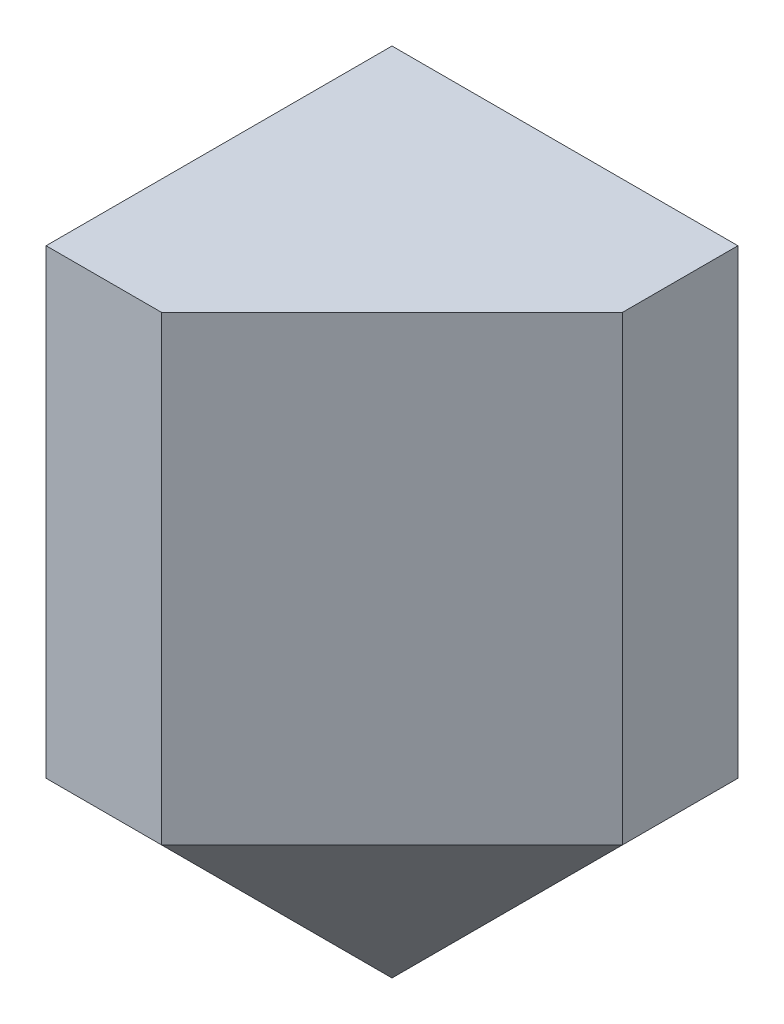
ISO-10303-21;
HEADER;
FILE_DESCRIPTION(('STEP AP214'),'2;1');
FILE_NAME('part.step','',(''),(''),'','','');
FILE_SCHEMA(('AUTOMOTIVE_DESIGN { 1 0 10303 214 1 1 1 1 }'));
ENDSEC;
DATA;
#1=APPLICATION_CONTEXT('core data for automotive mechanical design processes');
#2=APPLICATION_PROTOCOL_DEFINITION('international standard','automotive_design',2000,#1);
#3=PRODUCT_CONTEXT('',#1,'mechanical');
#4=PRODUCT('Part','Part','',(#3));
#5=PRODUCT_RELATED_PRODUCT_CATEGORY('part','',(#4));
#6=PRODUCT_DEFINITION_FORMATION('','',#4);
#7=PRODUCT_DEFINITION_CONTEXT('part definition',#1,'design');
#8=PRODUCT_DEFINITION('design','',#6,#7);
#9=PRODUCT_DEFINITION_SHAPE('','',#8);
#10=(LENGTH_UNIT() NAMED_UNIT(*) SI_UNIT(.MILLI.,.METRE.));
#11=(NAMED_UNIT(*) PLANE_ANGLE_UNIT() SI_UNIT($,.RADIAN.));
#12=(NAMED_UNIT(*) SI_UNIT($,.STERADIAN.) SOLID_ANGLE_UNIT());
#13=UNCERTAINTY_MEASURE_WITH_UNIT(LENGTH_MEASURE(1.E-05),#10,'distance_accuracy_value','');
#14=(GEOMETRIC_REPRESENTATION_CONTEXT(3) GLOBAL_UNCERTAINTY_ASSIGNED_CONTEXT((#13)) GLOBAL_UNIT_ASSIGNED_CONTEXT((#10,
#11,#12)) REPRESENTATION_CONTEXT('',''));
#15=CARTESIAN_POINT('',(0.,0.,0.));
#16=DIRECTION('',(0.,0.,1.));
#17=DIRECTION('',(1.,0.,0.));
#18=AXIS2_PLACEMENT_3D('',#15,#16,#17);
#19=CARTESIAN_POINT('',(0.,0.,30.));
#20=DIRECTION('',(1.,0.,0.));
#21=DIRECTION('',(0.,0.,-1.));
#22=AXIS2_PLACEMENT_3D('',#19,#20,#21);
#23=PLANE('',#22);
#24=CARTESIAN_POINT('',(0.,20.,18.));
#25=DIRECTION('',(-1.,0.,0.));
#26=DIRECTION('',(0.,0.,1.));
#27=AXIS2_PLACEMENT_3D('',#24,#25,#26);
#28=CIRCLE('',#27,2.74999999999999);
#29=CARTESIAN_POINT('',(0.,20.,20.75));
#30=VERTEX_POINT('',#29);
#31=EDGE_CURVE('E128',#30,#30,#28,.T.);
#32=ORIENTED_EDGE('',*,*,#31,.F.);
#33=EDGE_LOOP('',(#32));
#34=FACE_BOUND('',#33,.T.);
#35=CARTESIAN_POINT('',(0.,48.,14.));
#36=DIRECTION('',(-1.,0.,0.));
#37=DIRECTION('',(0.,0.,1.));
#38=AXIS2_PLACEMENT_3D('',#35,#36,#37);
#39=CIRCLE('',#38,2.75);
#40=CARTESIAN_POINT('',(0.,48.,16.75));
#41=VERTEX_POINT('',#40);
#42=EDGE_CURVE('E134',#41,#41,#39,.T.);
#43=ORIENTED_EDGE('',*,*,#42,.F.);
#44=EDGE_LOOP('',(#43));
#45=FACE_BOUND('',#44,.T.);
#46=DIRECTION('',(0.,0.,-1.));
#47=VECTOR('',#46,1.);
#48=CARTESIAN_POINT('',(0.,0.,30.));
#49=LINE('',#48,#47);
#50=CARTESIAN_POINT('',(0.,0.,9.99999999999995));
#51=VERTEX_POINT('',#50);
#52=CARTESIAN_POINT('',(0.,0.,0.));
#53=VERTEX_POINT('',#52);
#54=EDGE_CURVE('E159',#51,#53,#49,.T.);
#55=ORIENTED_EDGE('',*,*,#54,.F.);
#56=DIRECTION('',(0.,-0.707106781186546,-0.707106781186549));
#57=VECTOR('',#56,1.);
#58=CARTESIAN_POINT('',(0.,20.,30.));
#59=LINE('',#58,#57);
#60=CARTESIAN_POINT('',(0.,20.,30.));
#61=VERTEX_POINT('',#60);
#62=EDGE_CURVE('E11',#51,#61,#59,.F.);
#63=ORIENTED_EDGE('',*,*,#62,.T.);
#64=DIRECTION('',(0.,-1.,0.));
#65=VECTOR('',#64,1.);
#66=CARTESIAN_POINT('',(0.,0.,30.));
#67=LINE('',#66,#65);
#68=CARTESIAN_POINT('',(0.,60.,30.));
#69=VERTEX_POINT('',#68);
#70=EDGE_CURVE('E156',#69,#61,#67,.T.);
#71=ORIENTED_EDGE('',*,*,#70,.F.);
#72=DIRECTION('',(0.,0.,1.));
#73=VECTOR('',#72,1.);
#74=CARTESIAN_POINT('',(0.,60.,30.));
#75=LINE('',#74,#73);
#76=CARTESIAN_POINT('',(0.,60.,0.));
#77=VERTEX_POINT('',#76);
#78=EDGE_CURVE('E140',#77,#69,#75,.T.);
#79=ORIENTED_EDGE('',*,*,#78,.F.);
#80=DIRECTION('',(0.,-1.,0.));
#81=VECTOR('',#80,1.);
#82=CARTESIAN_POINT('',(0.,0.,0.));
#83=LINE('',#82,#81);
#84=EDGE_CURVE('E161',#77,#53,#83,.T.);
#85=ORIENTED_EDGE('',*,*,#84,.T.);
#86=EDGE_LOOP('',(#55,#63,#71,#79,#85));
#87=FACE_BOUND('',#86,.T.);
#88=ADVANCED_FACE('F41',(#34,#45,#87),#23,.F.);
#89=CARTESIAN_POINT('',(0.,0.,30.));
#90=DIRECTION('',(0.,1.,0.));
#91=DIRECTION('',(0.,0.,1.));
#92=AXIS2_PLACEMENT_3D('',#89,#90,#91);
#93=PLANE('',#92);
#94=DIRECTION('',(1.,0.,0.));
#95=VECTOR('',#94,1.);
#96=CARTESIAN_POINT('',(0.,0.,0.));
#97=LINE('',#96,#95);
#98=CARTESIAN_POINT('',(9.99999999999995,0.,0.));
#99=VERTEX_POINT('',#98);
#100=EDGE_CURVE('E164',#53,#99,#97,.T.);
#101=ORIENTED_EDGE('',*,*,#100,.T.);
#102=DIRECTION('',(0.,0.,1.));
#103=VECTOR('',#102,1.);
#104=CARTESIAN_POINT('',(9.99999999999995,0.,30.));
#105=LINE('',#104,#103);
#106=CARTESIAN_POINT('',(9.99999999999995,0.,9.99999999999995));
#107=VERTEX_POINT('',#106);
#108=EDGE_CURVE('E51',#99,#107,#105,.T.);
#109=ORIENTED_EDGE('',*,*,#108,.T.);
#110=DIRECTION('',(-1.,0.,0.));
#111=VECTOR('',#110,1.);
#112=CARTESIAN_POINT('',(0.,0.,9.99999999999995));
#113=LINE('',#112,#111);
#114=EDGE_CURVE('E62',#107,#51,#113,.T.);
#115=ORIENTED_EDGE('',*,*,#114,.T.);
#116=ORIENTED_EDGE('',*,*,#54,.T.);
#117=EDGE_LOOP('',(#101,#109,#115,#116));
#118=FACE_BOUND('',#117,.T.);
#119=ADVANCED_FACE('F217',(#118),#93,.F.);
#120=CARTESIAN_POINT('',(30.,0.,30.));
#121=DIRECTION('',(-1.,0.,0.));
#122=DIRECTION('',(0.,0.,1.));
#123=AXIS2_PLACEMENT_3D('',#120,#121,#122);
#124=PLANE('',#123);
#125=DIRECTION('',(0.,1.,0.));
#126=VECTOR('',#125,1.);
#127=CARTESIAN_POINT('',(30.,0.,0.));
#128=LINE('',#127,#126);
#129=CARTESIAN_POINT('',(30.,20.,0.));
#130=VERTEX_POINT('',#129);
#131=CARTESIAN_POINT('',(30.,60.,0.));
#132=VERTEX_POINT('',#131);
#133=EDGE_CURVE('E160',#130,#132,#128,.T.);
#134=ORIENTED_EDGE('',*,*,#133,.T.);
#135=DIRECTION('',(0.,0.,-1.));
#136=VECTOR('',#135,1.);
#137=CARTESIAN_POINT('',(30.,60.,0.));
#138=LINE('',#137,#136);
#139=CARTESIAN_POINT('',(30.,60.,9.99999999999992));
#140=VERTEX_POINT('',#139);
#141=EDGE_CURVE('E149',#140,#132,#138,.T.);
#142=ORIENTED_EDGE('',*,*,#141,.F.);
#143=DIRECTION('',(0.,-1.,0.));
#144=VECTOR('',#143,1.);
#145=CARTESIAN_POINT('',(30.,0.,9.99999999999995));
#146=LINE('',#145,#144);
#147=CARTESIAN_POINT('',(30.,20.,9.99999999999995));
#148=VERTEX_POINT('',#147);
#149=EDGE_CURVE('E174',#140,#148,#146,.T.);
#150=ORIENTED_EDGE('',*,*,#149,.T.);
#151=DIRECTION('',(0.,0.,-1.));
#152=VECTOR('',#151,1.);
#153=CARTESIAN_POINT('',(30.,20.,30.));
#154=LINE('',#153,#152);
#155=EDGE_CURVE('E172',#148,#130,#154,.T.);
#156=ORIENTED_EDGE('',*,*,#155,.T.);
#157=EDGE_LOOP('',(#134,#142,#150,#156));
#158=FACE_BOUND('',#157,.T.);
#159=ADVANCED_FACE('F223',(#158),#124,.F.);
#160=CARTESIAN_POINT('',(0.,0.,30.));
#161=DIRECTION('',(0.,0.,-1.));
#162=DIRECTION('',(-1.,0.,0.));
#163=AXIS2_PLACEMENT_3D('',#160,#161,#162);
#164=PLANE('',#163);
#165=DIRECTION('',(1.,0.,0.));
#166=VECTOR('',#165,1.);
#167=CARTESIAN_POINT('',(0.,20.,30.));
#168=LINE('',#167,#166);
#169=CARTESIAN_POINT('',(10.,20.,30.));
#170=VERTEX_POINT('',#169);
#171=EDGE_CURVE('E168',#61,#170,#168,.T.);
#172=ORIENTED_EDGE('',*,*,#171,.T.);
#173=DIRECTION('',(0.,1.,0.));
#174=VECTOR('',#173,1.);
#175=CARTESIAN_POINT('',(10.,0.,30.));
#176=LINE('',#175,#174);
#177=CARTESIAN_POINT('',(9.99999999999999,60.,30.));
#178=VERTEX_POINT('',#177);
#179=EDGE_CURVE('E170',#170,#178,#176,.T.);
#180=ORIENTED_EDGE('',*,*,#179,.T.);
#181=DIRECTION('',(1.,0.,0.));
#182=VECTOR('',#181,1.);
#183=CARTESIAN_POINT('',(9.99999999999999,60.,30.));
#184=LINE('',#183,#182);
#185=EDGE_CURVE('E143',#69,#178,#184,.T.);
#186=ORIENTED_EDGE('',*,*,#185,.F.);
#187=ORIENTED_EDGE('',*,*,#70,.T.);
#188=EDGE_LOOP('',(#172,#180,#186,#187));
#189=FACE_BOUND('',#188,.T.);
#190=ADVANCED_FACE('F197',(#189),#164,.F.);
#191=CARTESIAN_POINT('',(0.,0.,0.));
#192=DIRECTION('',(0.,0.,-1.));
#193=DIRECTION('',(-1.,0.,0.));
#194=AXIS2_PLACEMENT_3D('',#191,#192,#193);
#195=PLANE('',#194);
#196=CARTESIAN_POINT('',(18.,20.,0.));
#197=DIRECTION('',(0.,0.,-1.));
#198=DIRECTION('',(-1.,0.,0.));
#199=AXIS2_PLACEMENT_3D('',#196,#197,#198);
#200=CIRCLE('',#199,2.74999999999999);
#201=CARTESIAN_POINT('',(15.25,20.,0.));
#202=VERTEX_POINT('',#201);
#203=EDGE_CURVE('E118',#202,#202,#200,.T.);
#204=ORIENTED_EDGE('',*,*,#203,.F.);
#205=EDGE_LOOP('',(#204));
#206=FACE_BOUND('',#205,.T.);
#207=CARTESIAN_POINT('',(18.,48.,0.));
#208=DIRECTION('',(0.,0.,-1.));
#209=DIRECTION('',(-1.,0.,0.));
#210=AXIS2_PLACEMENT_3D('',#207,#208,#209);
#211=CIRCLE('',#210,2.74999999999999);
#212=CARTESIAN_POINT('',(15.25,48.,0.));
#213=VERTEX_POINT('',#212);
#214=EDGE_CURVE('E117',#213,#213,#211,.T.);
#215=ORIENTED_EDGE('',*,*,#214,.F.);
#216=EDGE_LOOP('',(#215));
#217=FACE_BOUND('',#216,.T.);
#218=ORIENTED_EDGE('',*,*,#133,.F.);
#219=DIRECTION('',(0.707106781186549,0.707106781186546,0.));
#220=VECTOR('',#219,1.);
#221=CARTESIAN_POINT('',(4.99999999999996,-4.99999999999997,0.));
#222=LINE('',#221,#220);
#223=EDGE_CURVE('E176',#130,#99,#222,.F.);
#224=ORIENTED_EDGE('',*,*,#223,.T.);
#225=ORIENTED_EDGE('',*,*,#100,.F.);
#226=ORIENTED_EDGE('',*,*,#84,.F.);
#227=DIRECTION('',(-1.,0.,0.));
#228=VECTOR('',#227,1.);
#229=CARTESIAN_POINT('',(0.,60.,0.));
#230=LINE('',#229,#228);
#231=EDGE_CURVE('E152',#132,#77,#230,.T.);
#232=ORIENTED_EDGE('',*,*,#231,.F.);
#233=EDGE_LOOP('',(#218,#224,#225,#226,#232));
#234=FACE_BOUND('',#233,.T.);
#235=ADVANCED_FACE('F214',(#206,#217,#234),#195,.T.);
#236=CARTESIAN_POINT('',(30.,20.,30.));
#237=DIRECTION('',(-0.707106781186546,0.707106781186549,0.));
#238=DIRECTION('',(0.,0.,-1.));
#239=AXIS2_PLACEMENT_3D('',#236,#237,#238);
#240=PLANE('',#239);
#241=ORIENTED_EDGE('',*,*,#223,.F.);
#242=ORIENTED_EDGE('',*,*,#155,.F.);
#243=DIRECTION('',(-0.707106781186549,-0.707106781186546,0.));
#244=VECTOR('',#243,1.);
#245=CARTESIAN_POINT('',(30.,20.,9.99999999999995));
#246=LINE('',#245,#244);
#247=EDGE_CURVE('E46',#107,#148,#246,.F.);
#248=ORIENTED_EDGE('',*,*,#247,.F.);
#249=ORIENTED_EDGE('',*,*,#108,.F.);
#250=EDGE_LOOP('',(#241,#242,#248,#249));
#251=FACE_BOUND('',#250,.T.);
#252=ADVANCED_FACE('F44',(#251),#240,.F.);
#253=CARTESIAN_POINT('',(0.,20.,30.));
#254=DIRECTION('',(0.,0.707106781186549,-0.707106781186546));
#255=DIRECTION('',(1.,0.,0.));
#256=AXIS2_PLACEMENT_3D('',#253,#254,#255);
#257=PLANE('',#256);
#258=ORIENTED_EDGE('',*,*,#62,.F.);
#259=ORIENTED_EDGE('',*,*,#114,.F.);
#260=DIRECTION('',(0.,0.707106781186546,0.707106781186549));
#261=VECTOR('',#260,1.);
#262=CARTESIAN_POINT('',(9.99999999999998,10.,20.));
#263=LINE('',#262,#261);
#264=EDGE_CURVE('E181',#170,#107,#263,.F.);
#265=ORIENTED_EDGE('',*,*,#264,.F.);
#266=ORIENTED_EDGE('',*,*,#171,.F.);
#267=EDGE_LOOP('',(#258,#259,#265,#266));
#268=FACE_BOUND('',#267,.T.);
#269=ADVANCED_FACE('F207',(#268),#257,.F.);
#270=CARTESIAN_POINT('',(30.,20.,9.99999999999995));
#271=DIRECTION('',(0.577350269189626,-0.577350269189628,0.577350269189624));
#272=DIRECTION('',(0.707106781186549,0.707106781186546,0.));
#273=AXIS2_PLACEMENT_3D('',#270,#271,#272);
#274=PLANE('',#273);
#275=ORIENTED_EDGE('',*,*,#264,.T.);
#276=ORIENTED_EDGE('',*,*,#247,.T.);
#277=DIRECTION('',(0.707106781186546,0.,-0.707106781186549));
#278=VECTOR('',#277,1.);
#279=CARTESIAN_POINT('',(30.,20.,9.99999999999995));
#280=LINE('',#279,#278);
#281=EDGE_CURVE('E155',#170,#148,#280,.T.);
#282=ORIENTED_EDGE('',*,*,#281,.F.);
#283=EDGE_LOOP('',(#275,#276,#282));
#284=FACE_BOUND('',#283,.T.);
#285=ADVANCED_FACE('F188',(#284),#274,.T.);
#286=CARTESIAN_POINT('',(10.,0.,30.));
#287=DIRECTION('',(-0.707106781186549,0.,-0.707106781186546));
#288=DIRECTION('',(0.,1.,0.));
#289=AXIS2_PLACEMENT_3D('',#286,#287,#288);
#290=PLANE('',#289);
#291=ORIENTED_EDGE('',*,*,#281,.T.);
#292=ORIENTED_EDGE('',*,*,#149,.F.);
#293=DIRECTION('',(0.707106781186546,0.,-0.707106781186549));
#294=VECTOR('',#293,1.);
#295=CARTESIAN_POINT('',(30.,60.,9.99999999999992));
#296=LINE('',#295,#294);
#297=EDGE_CURVE('E146',#178,#140,#296,.T.);
#298=ORIENTED_EDGE('',*,*,#297,.F.);
#299=ORIENTED_EDGE('',*,*,#179,.F.);
#300=EDGE_LOOP('',(#291,#292,#298,#299));
#301=FACE_BOUND('',#300,.T.);
#302=ADVANCED_FACE('F193',(#301),#290,.F.);
#303=CARTESIAN_POINT('',(0.,60.,0.));
#304=DIRECTION('',(0.,-1.,0.));
#305=DIRECTION('',(0.,0.,-1.));
#306=AXIS2_PLACEMENT_3D('',#303,#304,#305);
#307=PLANE('',#306);
#308=ORIENTED_EDGE('',*,*,#78,.T.);
#309=ORIENTED_EDGE('',*,*,#185,.T.);
#310=ORIENTED_EDGE('',*,*,#297,.T.);
#311=ORIENTED_EDGE('',*,*,#141,.T.);
#312=ORIENTED_EDGE('',*,*,#231,.T.);
#313=EDGE_LOOP('',(#308,#309,#310,#311,#312));
#314=FACE_BOUND('',#313,.T.);
#315=ADVANCED_FACE('F200',(#314),#307,.F.);
#316=CARTESIAN_POINT('',(13.,48.,14.));
#317=DIRECTION('',(-1.,0.,0.));
#318=DIRECTION('',(0.,0.,1.));
#319=AXIS2_PLACEMENT_3D('',#316,#317,#318);
#320=CONICAL_SURFACE('',#319,2.75,1.02974425867665);
#321=CARTESIAN_POINT('',(14.6523667023258,48.,14.));
#322=VERTEX_POINT('',#321);
#323=VERTEX_LOOP('',#322);
#324=FACE_BOUND('',#323,.T.);
#325=CARTESIAN_POINT('',(13.,48.,14.));
#326=DIRECTION('',(-1.,0.,0.));
#327=DIRECTION('',(0.,0.,1.));
#328=AXIS2_PLACEMENT_3D('',#325,#326,#327);
#329=CIRCLE('',#328,2.75);
#330=CARTESIAN_POINT('',(13.,48.,16.75));
#331=VERTEX_POINT('',#330);
#332=EDGE_CURVE('E137',#331,#331,#329,.T.);
#333=ORIENTED_EDGE('',*,*,#332,.T.);
#334=EDGE_LOOP('',(#333));
#335=FACE_BOUND('',#334,.T.);
#336=ADVANCED_FACE('F243',(#324,#335),#320,.F.);
#337=CARTESIAN_POINT('',(0.,48.,14.));
#338=DIRECTION('',(-1.,0.,0.));
#339=DIRECTION('',(0.,0.,1.));
#340=AXIS2_PLACEMENT_3D('',#337,#338,#339);
#341=CYLINDRICAL_SURFACE('',#340,2.75);
#342=ORIENTED_EDGE('',*,*,#332,.F.);
#343=EDGE_LOOP('',(#342));
#344=FACE_BOUND('',#343,.T.);
#345=ORIENTED_EDGE('',*,*,#42,.T.);
#346=EDGE_LOOP('',(#345));
#347=FACE_BOUND('',#346,.T.);
#348=ADVANCED_FACE('F248',(#344,#347),#341,.F.);
#349=CARTESIAN_POINT('',(13.,20.,18.));
#350=DIRECTION('',(-1.,0.,0.));
#351=DIRECTION('',(0.,0.,1.));
#352=AXIS2_PLACEMENT_3D('',#349,#350,#351);
#353=CONICAL_SURFACE('',#352,2.75,1.02974425867665);
#354=CARTESIAN_POINT('',(14.6523667023258,20.,18.));
#355=VERTEX_POINT('',#354);
#356=VERTEX_LOOP('',#355);
#357=FACE_BOUND('',#356,.T.);
#358=CARTESIAN_POINT('',(13.,20.,18.));
#359=DIRECTION('',(-1.,0.,0.));
#360=DIRECTION('',(0.,0.,1.));
#361=AXIS2_PLACEMENT_3D('',#358,#359,#360);
#362=CIRCLE('',#361,2.75);
#363=CARTESIAN_POINT('',(13.,20.,20.75));
#364=VERTEX_POINT('',#363);
#365=EDGE_CURVE('E131',#364,#364,#362,.T.);
#366=ORIENTED_EDGE('',*,*,#365,.T.);
#367=EDGE_LOOP('',(#366));
#368=FACE_BOUND('',#367,.T.);
#369=ADVANCED_FACE('F360',(#357,#368),#353,.F.);
#370=CARTESIAN_POINT('',(0.,20.,18.));
#371=DIRECTION('',(-1.,0.,0.));
#372=DIRECTION('',(0.,0.,1.));
#373=AXIS2_PLACEMENT_3D('',#370,#371,#372);
#374=CYLINDRICAL_SURFACE('',#373,2.74999999999999);
#375=ORIENTED_EDGE('',*,*,#365,.F.);
#376=EDGE_LOOP('',(#375));
#377=FACE_BOUND('',#376,.T.);
#378=ORIENTED_EDGE('',*,*,#31,.T.);
#379=EDGE_LOOP('',(#378));
#380=FACE_BOUND('',#379,.T.);
#381=ADVANCED_FACE('F369',(#377,#380),#374,.F.);
#382=CARTESIAN_POINT('',(18.,48.,13.));
#383=DIRECTION('',(0.,0.,-1.));
#384=DIRECTION('',(-1.,0.,0.));
#385=AXIS2_PLACEMENT_3D('',#382,#383,#384);
#386=CONICAL_SURFACE('',#385,2.75,1.02974425867665);
#387=CARTESIAN_POINT('',(18.,48.,14.6523667023258));
#388=VERTEX_POINT('',#387);
#389=VERTEX_LOOP('',#388);
#390=FACE_BOUND('',#389,.T.);
#391=CARTESIAN_POINT('',(18.,48.,13.));
#392=DIRECTION('',(0.,0.,-1.));
#393=DIRECTION('',(-1.,0.,0.));
#394=AXIS2_PLACEMENT_3D('',#391,#392,#393);
#395=CIRCLE('',#394,2.75);
#396=CARTESIAN_POINT('',(15.25,48.,13.));
#397=VERTEX_POINT('',#396);
#398=EDGE_CURVE('E121',#397,#397,#395,.T.);
#399=ORIENTED_EDGE('',*,*,#398,.T.);
#400=EDGE_LOOP('',(#399));
#401=FACE_BOUND('',#400,.T.);
#402=ADVANCED_FACE('F379',(#390,#401),#386,.F.);
#403=CARTESIAN_POINT('',(18.,48.,0.));
#404=DIRECTION('',(0.,0.,-1.));
#405=DIRECTION('',(-1.,0.,0.));
#406=AXIS2_PLACEMENT_3D('',#403,#404,#405);
#407=CYLINDRICAL_SURFACE('',#406,2.74999999999999);
#408=ORIENTED_EDGE('',*,*,#398,.F.);
#409=EDGE_LOOP('',(#408));
#410=FACE_BOUND('',#409,.T.);
#411=ORIENTED_EDGE('',*,*,#214,.T.);
#412=EDGE_LOOP('',(#411));
#413=FACE_BOUND('',#412,.T.);
#414=ADVANCED_FACE('F111',(#410,#413),#407,.F.);
#415=CARTESIAN_POINT('',(18.,20.,13.));
#416=DIRECTION('',(0.,0.,-1.));
#417=DIRECTION('',(-1.,0.,0.));
#418=AXIS2_PLACEMENT_3D('',#415,#416,#417);
#419=CONICAL_SURFACE('',#418,2.75,1.02974425867665);
#420=CARTESIAN_POINT('',(18.,20.,14.6523667023258));
#421=VERTEX_POINT('',#420);
#422=VERTEX_LOOP('',#421);
#423=FACE_BOUND('',#422,.T.);
#424=CARTESIAN_POINT('',(18.,20.,13.));
#425=DIRECTION('',(0.,0.,-1.));
#426=DIRECTION('',(-1.,0.,0.));
#427=AXIS2_PLACEMENT_3D('',#424,#425,#426);
#428=CIRCLE('',#427,2.75);
#429=CARTESIAN_POINT('',(15.25,20.,13.));
#430=VERTEX_POINT('',#429);
#431=EDGE_CURVE('E115',#430,#430,#428,.T.);
#432=ORIENTED_EDGE('',*,*,#431,.T.);
#433=EDGE_LOOP('',(#432));
#434=FACE_BOUND('',#433,.T.);
#435=ADVANCED_FACE('F107',(#423,#434),#419,.F.);
#436=CARTESIAN_POINT('',(18.,20.,0.));
#437=DIRECTION('',(0.,0.,-1.));
#438=DIRECTION('',(-1.,0.,0.));
#439=AXIS2_PLACEMENT_3D('',#436,#437,#438);
#440=CYLINDRICAL_SURFACE('',#439,2.74999999999999);
#441=ORIENTED_EDGE('',*,*,#431,.F.);
#442=EDGE_LOOP('',(#441));
#443=FACE_BOUND('',#442,.T.);
#444=ORIENTED_EDGE('',*,*,#203,.T.);
#445=EDGE_LOOP('',(#444));
#446=FACE_BOUND('',#445,.T.);
#447=ADVANCED_FACE('F110',(#443,#446),#440,.F.);
#448=CLOSED_SHELL('',(#88,#119,#159,#190,#235,#252,#269,#285,#302,#315,#336,#348,#369,#381,#402,
#414,#435,#447));
#449=MANIFOLD_SOLID_BREP('B2',#448);
#450=ADVANCED_BREP_SHAPE_REPRESENTATION('',(#18,#449),#14);
#451=SHAPE_DEFINITION_REPRESENTATION(#9,#450);
ENDSEC;
END-ISO-10303-21;
